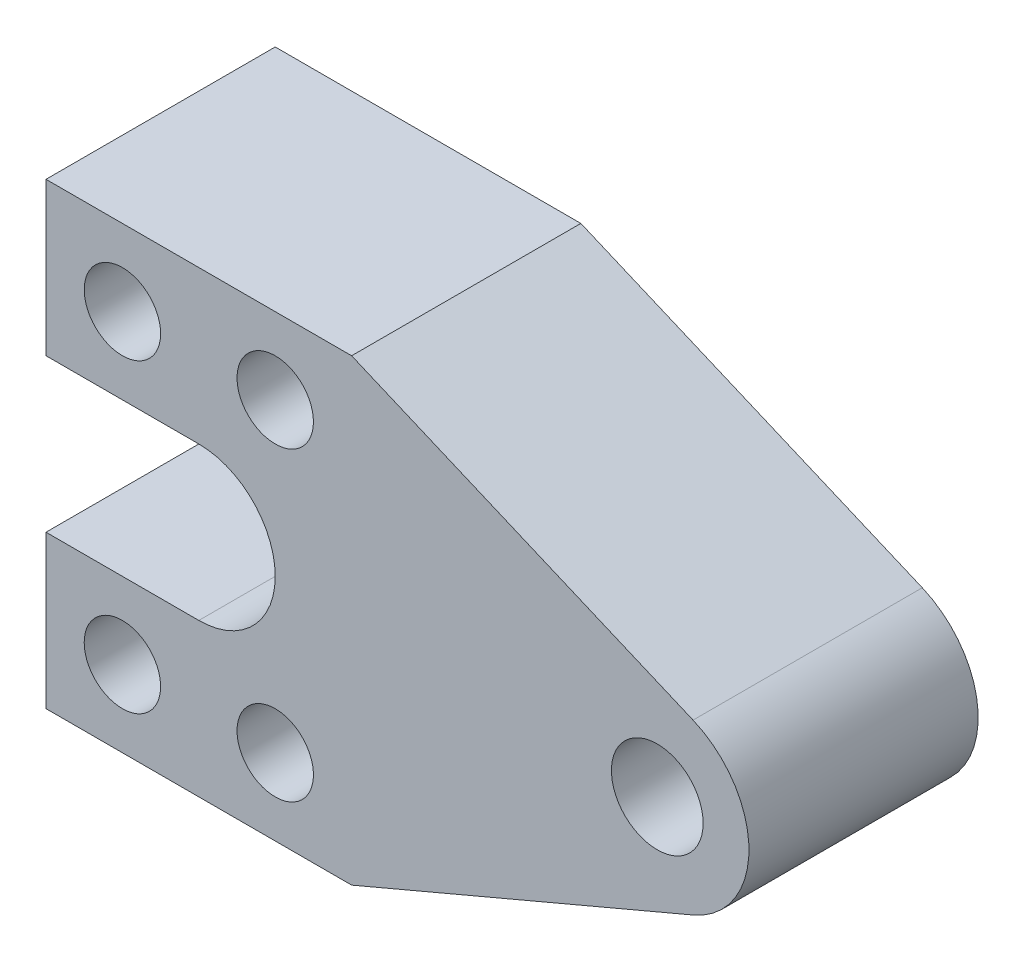
ISO-10303-21;
HEADER;
FILE_DESCRIPTION(('STEP AP214'),'2;1');
FILE_NAME('part.step','',(''),(''),'','','');
FILE_SCHEMA(('AUTOMOTIVE_DESIGN { 1 0 10303 214 1 1 1 1 }'));
ENDSEC;
DATA;
#1=APPLICATION_CONTEXT('core data for automotive mechanical design processes');
#2=APPLICATION_PROTOCOL_DEFINITION('international standard','automotive_design',2000,#1);
#3=PRODUCT_CONTEXT('',#1,'mechanical');
#4=PRODUCT('Part','Part','',(#3));
#5=PRODUCT_RELATED_PRODUCT_CATEGORY('part','',(#4));
#6=PRODUCT_DEFINITION_FORMATION('','',#4);
#7=PRODUCT_DEFINITION_CONTEXT('part definition',#1,'design');
#8=PRODUCT_DEFINITION('design','',#6,#7);
#9=PRODUCT_DEFINITION_SHAPE('','',#8);
#10=(LENGTH_UNIT() NAMED_UNIT(*) SI_UNIT(.MILLI.,.METRE.));
#11=(NAMED_UNIT(*) PLANE_ANGLE_UNIT() SI_UNIT($,.RADIAN.));
#12=(NAMED_UNIT(*) SI_UNIT($,.STERADIAN.) SOLID_ANGLE_UNIT());
#13=UNCERTAINTY_MEASURE_WITH_UNIT(LENGTH_MEASURE(1.E-05),#10,'distance_accuracy_value','');
#14=(GEOMETRIC_REPRESENTATION_CONTEXT(3) GLOBAL_UNCERTAINTY_ASSIGNED_CONTEXT((#13)) GLOBAL_UNIT_ASSIGNED_CONTEXT((#10,
#11,#12)) REPRESENTATION_CONTEXT('',''));
#15=CARTESIAN_POINT('',(0.,0.,0.));
#16=DIRECTION('',(0.,0.,1.));
#17=DIRECTION('',(1.,0.,0.));
#18=AXIS2_PLACEMENT_3D('',#15,#16,#17);
#19=CARTESIAN_POINT('',(30.,40.,15.));
#20=DIRECTION('',(0.,0.,-1.));
#21=DIRECTION('',(-1.,0.,0.));
#22=AXIS2_PLACEMENT_3D('',#19,#20,#21);
#23=PLANE('',#22);
#24=CARTESIAN_POINT('',(30.,40.,15.));
#25=DIRECTION('',(0.,0.,-1.));
#26=DIRECTION('',(-1.,0.,0.));
#27=AXIS2_PLACEMENT_3D('',#24,#25,#26);
#28=CIRCLE('',#27,10.);
#29=CARTESIAN_POINT('',(30.,50.,15.));
#30=VERTEX_POINT('',#29);
#31=CARTESIAN_POINT('',(30.,30.,15.));
#32=VERTEX_POINT('',#31);
#33=EDGE_CURVE('E161',#30,#32,#28,.T.);
#34=ORIENTED_EDGE('',*,*,#33,.T.);
#35=DIRECTION('',(-1.,0.,0.));
#36=VECTOR('',#35,1.);
#37=CARTESIAN_POINT('',(30.,30.,15.));
#38=LINE('',#37,#36);
#39=CARTESIAN_POINT('',(9.99999999999999,30.,15.));
#40=VERTEX_POINT('',#39);
#41=EDGE_CURVE('E99',#32,#40,#38,.T.);
#42=ORIENTED_EDGE('',*,*,#41,.T.);
#43=DIRECTION('',(0.,-1.,0.));
#44=VECTOR('',#43,1.);
#45=CARTESIAN_POINT('',(9.99999999999999,30.,15.));
#46=LINE('',#45,#44);
#47=CARTESIAN_POINT('',(10.,10.,15.));
#48=VERTEX_POINT('',#47);
#49=EDGE_CURVE('E182',#40,#48,#46,.T.);
#50=ORIENTED_EDGE('',*,*,#49,.T.);
#51=DIRECTION('',(1.,0.,0.));
#52=VECTOR('',#51,1.);
#53=CARTESIAN_POINT('',(10.,10.,15.));
#54=LINE('',#53,#52);
#55=CARTESIAN_POINT('',(50.,10.,15.));
#56=VERTEX_POINT('',#55);
#57=EDGE_CURVE('E201',#48,#56,#54,.T.);
#58=ORIENTED_EDGE('',*,*,#57,.T.);
#59=DIRECTION('',(0.920618310368742,0.390463732776557,0.));
#60=VECTOR('',#59,1.);
#61=CARTESIAN_POINT('',(50.,10.,15.));
#62=LINE('',#61,#60);
#63=CARTESIAN_POINT('',(94.6855647933187,28.9525802755751,15.));
#64=VERTEX_POINT('',#63);
#65=EDGE_CURVE('E198',#56,#64,#62,.T.);
#66=ORIENTED_EDGE('',*,*,#65,.T.);
#67=CARTESIAN_POINT('',(90.,40.,15.));
#68=DIRECTION('',(0.,0.,1.));
#69=DIRECTION('',(1.,0.,0.));
#70=AXIS2_PLACEMENT_3D('',#67,#68,#69);
#71=CIRCLE('',#70,12.);
#72=CARTESIAN_POINT('',(94.6855647933187,51.0474197244249,15.));
#73=VERTEX_POINT('',#72);
#74=EDGE_CURVE('E200',#64,#73,#71,.T.);
#75=ORIENTED_EDGE('',*,*,#74,.T.);
#76=DIRECTION('',(-0.920618310368742,0.390463732776557,0.));
#77=VECTOR('',#76,1.);
#78=CARTESIAN_POINT('',(50.,70.,15.));
#79=LINE('',#78,#77);
#80=CARTESIAN_POINT('',(50.,70.,15.));
#81=VERTEX_POINT('',#80);
#82=EDGE_CURVE('E124',#73,#81,#79,.T.);
#83=ORIENTED_EDGE('',*,*,#82,.T.);
#84=DIRECTION('',(-1.,0.,0.));
#85=VECTOR('',#84,1.);
#86=CARTESIAN_POINT('',(9.99999999999999,70.,15.));
#87=LINE('',#86,#85);
#88=CARTESIAN_POINT('',(9.99999999999999,70.,15.));
#89=VERTEX_POINT('',#88);
#90=EDGE_CURVE('E118',#81,#89,#87,.T.);
#91=ORIENTED_EDGE('',*,*,#90,.T.);
#92=DIRECTION('',(0.,-1.,0.));
#93=VECTOR('',#92,1.);
#94=CARTESIAN_POINT('',(9.99999999999999,70.,15.));
#95=LINE('',#94,#93);
#96=CARTESIAN_POINT('',(9.99999999999999,50.,15.));
#97=VERTEX_POINT('',#96);
#98=EDGE_CURVE('E122',#89,#97,#95,.T.);
#99=ORIENTED_EDGE('',*,*,#98,.T.);
#100=DIRECTION('',(1.,0.,0.));
#101=VECTOR('',#100,1.);
#102=CARTESIAN_POINT('',(9.99999999999999,50.,15.));
#103=LINE('',#102,#101);
#104=EDGE_CURVE('E50',#97,#30,#103,.T.);
#105=ORIENTED_EDGE('',*,*,#104,.T.);
#106=EDGE_LOOP('',(#34,#42,#50,#58,#66,#75,#83,#91,#99,#105));
#107=FACE_BOUND('',#106,.T.);
#108=CARTESIAN_POINT('',(20.,60.,15.));
#109=DIRECTION('',(0.,0.,1.));
#110=DIRECTION('',(1.,0.,0.));
#111=AXIS2_PLACEMENT_3D('',#108,#109,#110);
#112=CIRCLE('',#111,5.);
#113=CARTESIAN_POINT('',(25.,60.,15.));
#114=VERTEX_POINT('',#113);
#115=EDGE_CURVE('E146',#114,#114,#112,.T.);
#116=ORIENTED_EDGE('',*,*,#115,.F.);
#117=EDGE_LOOP('',(#116));
#118=FACE_BOUND('',#117,.T.);
#119=CARTESIAN_POINT('',(40.,60.,15.));
#120=DIRECTION('',(0.,0.,1.));
#121=DIRECTION('',(1.,0.,0.));
#122=AXIS2_PLACEMENT_3D('',#119,#120,#121);
#123=CIRCLE('',#122,5.);
#124=CARTESIAN_POINT('',(45.,60.,15.));
#125=VERTEX_POINT('',#124);
#126=EDGE_CURVE('E212',#125,#125,#123,.T.);
#127=ORIENTED_EDGE('',*,*,#126,.F.);
#128=EDGE_LOOP('',(#127));
#129=FACE_BOUND('',#128,.T.);
#130=CARTESIAN_POINT('',(90.,40.,15.));
#131=DIRECTION('',(0.,0.,1.));
#132=DIRECTION('',(1.,0.,0.));
#133=AXIS2_PLACEMENT_3D('',#130,#131,#132);
#134=CIRCLE('',#133,6.);
#135=CARTESIAN_POINT('',(96.,40.,15.));
#136=VERTEX_POINT('',#135);
#137=EDGE_CURVE('E218',#136,#136,#134,.T.);
#138=ORIENTED_EDGE('',*,*,#137,.F.);
#139=EDGE_LOOP('',(#138));
#140=FACE_BOUND('',#139,.T.);
#141=CARTESIAN_POINT('',(40.,20.,15.));
#142=DIRECTION('',(0.,0.,1.));
#143=DIRECTION('',(-1.,0.,0.));
#144=AXIS2_PLACEMENT_3D('',#141,#142,#143);
#145=CIRCLE('',#144,5.);
#146=CARTESIAN_POINT('',(35.,20.,15.));
#147=VERTEX_POINT('',#146);
#148=EDGE_CURVE('E224',#147,#147,#145,.T.);
#149=ORIENTED_EDGE('',*,*,#148,.F.);
#150=EDGE_LOOP('',(#149));
#151=FACE_BOUND('',#150,.T.);
#152=CARTESIAN_POINT('',(20.,20.,15.));
#153=DIRECTION('',(0.,0.,1.));
#154=DIRECTION('',(-1.,0.,0.));
#155=AXIS2_PLACEMENT_3D('',#152,#153,#154);
#156=CIRCLE('',#155,5.);
#157=CARTESIAN_POINT('',(15.,20.,15.));
#158=VERTEX_POINT('',#157);
#159=EDGE_CURVE('E230',#158,#158,#156,.T.);
#160=ORIENTED_EDGE('',*,*,#159,.F.);
#161=EDGE_LOOP('',(#160));
#162=FACE_BOUND('',#161,.T.);
#163=ADVANCED_FACE('F33',(#107,#118,#129,#140,#151,#162),#23,.F.);
#164=CARTESIAN_POINT('',(30.,40.,-15.));
#165=DIRECTION('',(0.,0.,-1.));
#166=DIRECTION('',(-1.,0.,0.));
#167=AXIS2_PLACEMENT_3D('',#164,#165,#166);
#168=PLANE('',#167);
#169=CARTESIAN_POINT('',(40.,20.,-15.));
#170=DIRECTION('',(0.,0.,1.));
#171=DIRECTION('',(-1.,0.,0.));
#172=AXIS2_PLACEMENT_3D('',#169,#170,#171);
#173=CIRCLE('',#172,5.);
#174=CARTESIAN_POINT('',(35.,20.,-15.));
#175=VERTEX_POINT('',#174);
#176=EDGE_CURVE('E227',#175,#175,#173,.T.);
#177=ORIENTED_EDGE('',*,*,#176,.T.);
#178=EDGE_LOOP('',(#177));
#179=FACE_BOUND('',#178,.T.);
#180=CARTESIAN_POINT('',(40.,60.,-15.));
#181=DIRECTION('',(0.,0.,1.));
#182=DIRECTION('',(1.,0.,0.));
#183=AXIS2_PLACEMENT_3D('',#180,#181,#182);
#184=CIRCLE('',#183,5.);
#185=CARTESIAN_POINT('',(45.,60.,-15.));
#186=VERTEX_POINT('',#185);
#187=EDGE_CURVE('E215',#186,#186,#184,.T.);
#188=ORIENTED_EDGE('',*,*,#187,.T.);
#189=EDGE_LOOP('',(#188));
#190=FACE_BOUND('',#189,.T.);
#191=CARTESIAN_POINT('',(30.,40.,-15.));
#192=DIRECTION('',(0.,0.,-1.));
#193=DIRECTION('',(-1.,0.,0.));
#194=AXIS2_PLACEMENT_3D('',#191,#192,#193);
#195=CIRCLE('',#194,10.);
#196=CARTESIAN_POINT('',(30.,50.,-15.));
#197=VERTEX_POINT('',#196);
#198=CARTESIAN_POINT('',(30.,30.,-15.));
#199=VERTEX_POINT('',#198);
#200=EDGE_CURVE('E142',#197,#199,#195,.T.);
#201=ORIENTED_EDGE('',*,*,#200,.F.);
#202=DIRECTION('',(1.,0.,0.));
#203=VECTOR('',#202,1.);
#204=CARTESIAN_POINT('',(9.99999999999999,50.,-15.));
#205=LINE('',#204,#203);
#206=CARTESIAN_POINT('',(9.99999999999999,50.,-15.));
#207=VERTEX_POINT('',#206);
#208=EDGE_CURVE('E91',#207,#197,#205,.T.);
#209=ORIENTED_EDGE('',*,*,#208,.F.);
#210=DIRECTION('',(0.,-1.,0.));
#211=VECTOR('',#210,1.);
#212=CARTESIAN_POINT('',(9.99999999999999,70.,-15.));
#213=LINE('',#212,#211);
#214=CARTESIAN_POINT('',(9.99999999999999,70.,-15.));
#215=VERTEX_POINT('',#214);
#216=EDGE_CURVE('E85',#215,#207,#213,.T.);
#217=ORIENTED_EDGE('',*,*,#216,.F.);
#218=DIRECTION('',(-1.,0.,0.));
#219=VECTOR('',#218,1.);
#220=CARTESIAN_POINT('',(9.99999999999999,70.,-15.));
#221=LINE('',#220,#219);
#222=CARTESIAN_POINT('',(50.,70.,-15.));
#223=VERTEX_POINT('',#222);
#224=EDGE_CURVE('E132',#223,#215,#221,.T.);
#225=ORIENTED_EDGE('',*,*,#224,.F.);
#226=DIRECTION('',(-0.920618310368742,0.390463732776557,0.));
#227=VECTOR('',#226,1.);
#228=CARTESIAN_POINT('',(50.,70.,-15.));
#229=LINE('',#228,#227);
#230=CARTESIAN_POINT('',(94.6855647933187,51.0474197244249,-15.));
#231=VERTEX_POINT('',#230);
#232=EDGE_CURVE('E156',#231,#223,#229,.T.);
#233=ORIENTED_EDGE('',*,*,#232,.F.);
#234=CARTESIAN_POINT('',(90.,40.,-15.));
#235=DIRECTION('',(0.,0.,1.));
#236=DIRECTION('',(1.,0.,0.));
#237=AXIS2_PLACEMENT_3D('',#234,#235,#236);
#238=CIRCLE('',#237,12.);
#239=CARTESIAN_POINT('',(94.6855647933187,28.9525802755751,-15.));
#240=VERTEX_POINT('',#239);
#241=EDGE_CURVE('E154',#240,#231,#238,.T.);
#242=ORIENTED_EDGE('',*,*,#241,.F.);
#243=DIRECTION('',(0.920618310368742,0.390463732776557,0.));
#244=VECTOR('',#243,1.);
#245=CARTESIAN_POINT('',(50.,10.,-15.));
#246=LINE('',#245,#244);
#247=CARTESIAN_POINT('',(50.,10.,-15.));
#248=VERTEX_POINT('',#247);
#249=EDGE_CURVE('E152',#248,#240,#246,.T.);
#250=ORIENTED_EDGE('',*,*,#249,.F.);
#251=DIRECTION('',(1.,0.,0.));
#252=VECTOR('',#251,1.);
#253=CARTESIAN_POINT('',(10.,10.,-15.));
#254=LINE('',#253,#252);
#255=CARTESIAN_POINT('',(10.,10.,-15.));
#256=VERTEX_POINT('',#255);
#257=EDGE_CURVE('E150',#256,#248,#254,.T.);
#258=ORIENTED_EDGE('',*,*,#257,.F.);
#259=DIRECTION('',(0.,-1.,0.));
#260=VECTOR('',#259,1.);
#261=CARTESIAN_POINT('',(9.99999999999999,30.,-15.));
#262=LINE('',#261,#260);
#263=CARTESIAN_POINT('',(9.99999999999999,30.,-15.));
#264=VERTEX_POINT('',#263);
#265=EDGE_CURVE('E148',#264,#256,#262,.T.);
#266=ORIENTED_EDGE('',*,*,#265,.F.);
#267=DIRECTION('',(-1.,0.,0.));
#268=VECTOR('',#267,1.);
#269=CARTESIAN_POINT('',(30.,30.,-15.));
#270=LINE('',#269,#268);
#271=EDGE_CURVE('E145',#199,#264,#270,.T.);
#272=ORIENTED_EDGE('',*,*,#271,.F.);
#273=EDGE_LOOP('',(#201,#209,#217,#225,#233,#242,#250,#258,#266,#272));
#274=FACE_BOUND('',#273,.T.);
#275=CARTESIAN_POINT('',(20.,60.,-15.));
#276=DIRECTION('',(0.,0.,1.));
#277=DIRECTION('',(1.,0.,0.));
#278=AXIS2_PLACEMENT_3D('',#275,#276,#277);
#279=CIRCLE('',#278,5.);
#280=CARTESIAN_POINT('',(25.,60.,-15.));
#281=VERTEX_POINT('',#280);
#282=EDGE_CURVE('E209',#281,#281,#279,.T.);
#283=ORIENTED_EDGE('',*,*,#282,.T.);
#284=EDGE_LOOP('',(#283));
#285=FACE_BOUND('',#284,.T.);
#286=CARTESIAN_POINT('',(90.,40.,-15.));
#287=DIRECTION('',(0.,0.,1.));
#288=DIRECTION('',(1.,0.,0.));
#289=AXIS2_PLACEMENT_3D('',#286,#287,#288);
#290=CIRCLE('',#289,6.);
#291=CARTESIAN_POINT('',(96.,40.,-15.));
#292=VERTEX_POINT('',#291);
#293=EDGE_CURVE('E221',#292,#292,#290,.T.);
#294=ORIENTED_EDGE('',*,*,#293,.T.);
#295=EDGE_LOOP('',(#294));
#296=FACE_BOUND('',#295,.T.);
#297=CARTESIAN_POINT('',(20.,20.,-15.));
#298=DIRECTION('',(0.,0.,1.));
#299=DIRECTION('',(-1.,0.,0.));
#300=AXIS2_PLACEMENT_3D('',#297,#298,#299);
#301=CIRCLE('',#300,5.);
#302=CARTESIAN_POINT('',(15.,20.,-15.));
#303=VERTEX_POINT('',#302);
#304=EDGE_CURVE('E233',#303,#303,#301,.T.);
#305=ORIENTED_EDGE('',*,*,#304,.T.);
#306=EDGE_LOOP('',(#305));
#307=FACE_BOUND('',#306,.T.);
#308=ADVANCED_FACE('F186',(#179,#190,#274,#285,#296,#307),#168,.T.);
#309=CARTESIAN_POINT('',(30.,40.,15.));
#310=DIRECTION('',(0.,0.,-1.));
#311=DIRECTION('',(-1.,0.,0.));
#312=AXIS2_PLACEMENT_3D('',#309,#310,#311);
#313=CYLINDRICAL_SURFACE('',#312,10.);
#314=ORIENTED_EDGE('',*,*,#200,.T.);
#315=DIRECTION('',(0.,0.,-1.));
#316=VECTOR('',#315,1.);
#317=CARTESIAN_POINT('',(30.,30.,15.));
#318=LINE('',#317,#316);
#319=EDGE_CURVE('E11',#32,#199,#318,.T.);
#320=ORIENTED_EDGE('',*,*,#319,.F.);
#321=ORIENTED_EDGE('',*,*,#33,.F.);
#322=DIRECTION('',(0.,0.,-1.));
#323=VECTOR('',#322,1.);
#324=CARTESIAN_POINT('',(30.,50.,15.));
#325=LINE('',#324,#323);
#326=EDGE_CURVE('E138',#30,#197,#325,.T.);
#327=ORIENTED_EDGE('',*,*,#326,.T.);
#328=EDGE_LOOP('',(#314,#320,#321,#327));
#329=FACE_BOUND('',#328,.T.);
#330=ADVANCED_FACE('F35',(#329),#313,.F.);
#331=CARTESIAN_POINT('',(30.,30.,15.));
#332=DIRECTION('',(0.,-1.,0.));
#333=DIRECTION('',(0.,0.,-1.));
#334=AXIS2_PLACEMENT_3D('',#331,#332,#333);
#335=PLANE('',#334);
#336=ORIENTED_EDGE('',*,*,#271,.T.);
#337=DIRECTION('',(0.,0.,-1.));
#338=VECTOR('',#337,1.);
#339=CARTESIAN_POINT('',(9.99999999999999,30.,15.));
#340=LINE('',#339,#338);
#341=EDGE_CURVE('E42',#40,#264,#340,.T.);
#342=ORIENTED_EDGE('',*,*,#341,.F.);
#343=ORIENTED_EDGE('',*,*,#41,.F.);
#344=ORIENTED_EDGE('',*,*,#319,.T.);
#345=EDGE_LOOP('',(#336,#342,#343,#344));
#346=FACE_BOUND('',#345,.T.);
#347=ADVANCED_FACE('F273',(#346),#335,.F.);
#348=CARTESIAN_POINT('',(9.99999999999999,30.,15.));
#349=DIRECTION('',(1.,0.,0.));
#350=DIRECTION('',(0.,1.,0.));
#351=AXIS2_PLACEMENT_3D('',#348,#349,#350);
#352=PLANE('',#351);
#353=ORIENTED_EDGE('',*,*,#265,.T.);
#354=DIRECTION('',(0.,0.,-1.));
#355=VECTOR('',#354,1.);
#356=CARTESIAN_POINT('',(10.,10.,15.));
#357=LINE('',#356,#355);
#358=EDGE_CURVE('E174',#48,#256,#357,.T.);
#359=ORIENTED_EDGE('',*,*,#358,.F.);
#360=ORIENTED_EDGE('',*,*,#49,.F.);
#361=ORIENTED_EDGE('',*,*,#341,.T.);
#362=EDGE_LOOP('',(#353,#359,#360,#361));
#363=FACE_BOUND('',#362,.T.);
#364=ADVANCED_FACE('F180',(#363),#352,.F.);
#365=CARTESIAN_POINT('',(10.,10.,15.));
#366=DIRECTION('',(0.,1.,0.));
#367=DIRECTION('',(0.,0.,1.));
#368=AXIS2_PLACEMENT_3D('',#365,#366,#367);
#369=PLANE('',#368);
#370=ORIENTED_EDGE('',*,*,#257,.T.);
#371=DIRECTION('',(0.,0.,-1.));
#372=VECTOR('',#371,1.);
#373=CARTESIAN_POINT('',(50.,10.,15.));
#374=LINE('',#373,#372);
#375=EDGE_CURVE('E171',#56,#248,#374,.T.);
#376=ORIENTED_EDGE('',*,*,#375,.F.);
#377=ORIENTED_EDGE('',*,*,#57,.F.);
#378=ORIENTED_EDGE('',*,*,#358,.T.);
#379=EDGE_LOOP('',(#370,#376,#377,#378));
#380=FACE_BOUND('',#379,.T.);
#381=ADVANCED_FACE('F192',(#380),#369,.F.);
#382=CARTESIAN_POINT('',(50.,10.,15.));
#383=DIRECTION('',(-0.390463732776557,0.920618310368742,0.));
#384=DIRECTION('',(-0.920618310368742,-0.390463732776557,0.));
#385=AXIS2_PLACEMENT_3D('',#382,#383,#384);
#386=PLANE('',#385);
#387=ORIENTED_EDGE('',*,*,#249,.T.);
#388=DIRECTION('',(0.,0.,-1.));
#389=VECTOR('',#388,1.);
#390=CARTESIAN_POINT('',(94.6855647933187,28.9525802755751,15.));
#391=LINE('',#390,#389);
#392=EDGE_CURVE('E168',#64,#240,#391,.T.);
#393=ORIENTED_EDGE('',*,*,#392,.F.);
#394=ORIENTED_EDGE('',*,*,#65,.F.);
#395=ORIENTED_EDGE('',*,*,#375,.T.);
#396=EDGE_LOOP('',(#387,#393,#394,#395));
#397=FACE_BOUND('',#396,.T.);
#398=ADVANCED_FACE('F196',(#397),#386,.F.);
#399=CARTESIAN_POINT('',(90.,40.,15.));
#400=DIRECTION('',(0.,0.,-1.));
#401=DIRECTION('',(-1.,0.,0.));
#402=AXIS2_PLACEMENT_3D('',#399,#400,#401);
#403=CYLINDRICAL_SURFACE('',#402,12.);
#404=ORIENTED_EDGE('',*,*,#241,.T.);
#405=DIRECTION('',(0.,0.,-1.));
#406=VECTOR('',#405,1.);
#407=CARTESIAN_POINT('',(94.6855647933187,51.0474197244249,15.));
#408=LINE('',#407,#406);
#409=EDGE_CURVE('E165',#73,#231,#408,.T.);
#410=ORIENTED_EDGE('',*,*,#409,.F.);
#411=ORIENTED_EDGE('',*,*,#74,.F.);
#412=ORIENTED_EDGE('',*,*,#392,.T.);
#413=EDGE_LOOP('',(#404,#410,#411,#412));
#414=FACE_BOUND('',#413,.T.);
#415=ADVANCED_FACE('F263',(#414),#403,.T.);
#416=CARTESIAN_POINT('',(50.,70.,15.));
#417=DIRECTION('',(-0.390463732776557,-0.920618310368742,0.));
#418=DIRECTION('',(0.920618310368742,-0.390463732776557,0.));
#419=AXIS2_PLACEMENT_3D('',#416,#417,#418);
#420=PLANE('',#419);
#421=ORIENTED_EDGE('',*,*,#232,.T.);
#422=DIRECTION('',(0.,0.,-1.));
#423=VECTOR('',#422,1.);
#424=CARTESIAN_POINT('',(50.,70.,15.));
#425=LINE('',#424,#423);
#426=EDGE_CURVE('E133',#81,#223,#425,.T.);
#427=ORIENTED_EDGE('',*,*,#426,.F.);
#428=ORIENTED_EDGE('',*,*,#82,.F.);
#429=ORIENTED_EDGE('',*,*,#409,.T.);
#430=EDGE_LOOP('',(#421,#427,#428,#429));
#431=FACE_BOUND('',#430,.T.);
#432=ADVANCED_FACE('F260',(#431),#420,.F.);
#433=CARTESIAN_POINT('',(9.99999999999999,70.,15.));
#434=DIRECTION('',(0.,-1.,0.));
#435=DIRECTION('',(1.,0.,0.));
#436=AXIS2_PLACEMENT_3D('',#433,#434,#435);
#437=PLANE('',#436);
#438=ORIENTED_EDGE('',*,*,#224,.T.);
#439=DIRECTION('',(0.,0.,-1.));
#440=VECTOR('',#439,1.);
#441=CARTESIAN_POINT('',(9.99999999999999,70.,15.));
#442=LINE('',#441,#440);
#443=EDGE_CURVE('E129',#89,#215,#442,.T.);
#444=ORIENTED_EDGE('',*,*,#443,.F.);
#445=ORIENTED_EDGE('',*,*,#90,.F.);
#446=ORIENTED_EDGE('',*,*,#426,.T.);
#447=EDGE_LOOP('',(#438,#444,#445,#446));
#448=FACE_BOUND('',#447,.T.);
#449=ADVANCED_FACE('F130',(#448),#437,.F.);
#450=CARTESIAN_POINT('',(9.99999999999999,70.,15.));
#451=DIRECTION('',(1.,0.,0.));
#452=DIRECTION('',(0.,0.,-1.));
#453=AXIS2_PLACEMENT_3D('',#450,#451,#452);
#454=PLANE('',#453);
#455=ORIENTED_EDGE('',*,*,#216,.T.);
#456=DIRECTION('',(0.,0.,-1.));
#457=VECTOR('',#456,1.);
#458=CARTESIAN_POINT('',(9.99999999999999,50.,15.));
#459=LINE('',#458,#457);
#460=EDGE_CURVE('E134',#97,#207,#459,.T.);
#461=ORIENTED_EDGE('',*,*,#460,.F.);
#462=ORIENTED_EDGE('',*,*,#98,.F.);
#463=ORIENTED_EDGE('',*,*,#443,.T.);
#464=EDGE_LOOP('',(#455,#461,#462,#463));
#465=FACE_BOUND('',#464,.T.);
#466=ADVANCED_FACE('F136',(#465),#454,.F.);
#467=CARTESIAN_POINT('',(9.99999999999999,50.,15.));
#468=DIRECTION('',(0.,1.,0.));
#469=DIRECTION('',(-1.,0.,0.));
#470=AXIS2_PLACEMENT_3D('',#467,#468,#469);
#471=PLANE('',#470);
#472=ORIENTED_EDGE('',*,*,#208,.T.);
#473=ORIENTED_EDGE('',*,*,#326,.F.);
#474=ORIENTED_EDGE('',*,*,#104,.F.);
#475=ORIENTED_EDGE('',*,*,#460,.T.);
#476=EDGE_LOOP('',(#472,#473,#474,#475));
#477=FACE_BOUND('',#476,.T.);
#478=ADVANCED_FACE('F253',(#477),#471,.F.);
#479=CARTESIAN_POINT('',(20.,60.,15.));
#480=DIRECTION('',(0.,0.,-1.));
#481=DIRECTION('',(-1.,0.,0.));
#482=AXIS2_PLACEMENT_3D('',#479,#480,#481);
#483=CYLINDRICAL_SURFACE('',#482,5.);
#484=ORIENTED_EDGE('',*,*,#115,.T.);
#485=EDGE_LOOP('',(#484));
#486=FACE_BOUND('',#485,.T.);
#487=ORIENTED_EDGE('',*,*,#282,.F.);
#488=EDGE_LOOP('',(#487));
#489=FACE_BOUND('',#488,.T.);
#490=ADVANCED_FACE('F250',(#486,#489),#483,.F.);
#491=CARTESIAN_POINT('',(40.,60.,15.));
#492=DIRECTION('',(0.,0.,-1.));
#493=DIRECTION('',(-1.,0.,0.));
#494=AXIS2_PLACEMENT_3D('',#491,#492,#493);
#495=CYLINDRICAL_SURFACE('',#494,5.);
#496=ORIENTED_EDGE('',*,*,#126,.T.);
#497=EDGE_LOOP('',(#496));
#498=FACE_BOUND('',#497,.T.);
#499=ORIENTED_EDGE('',*,*,#187,.F.);
#500=EDGE_LOOP('',(#499));
#501=FACE_BOUND('',#500,.T.);
#502=ADVANCED_FACE('F349',(#498,#501),#495,.F.);
#503=CARTESIAN_POINT('',(90.,40.,15.));
#504=DIRECTION('',(0.,0.,-1.));
#505=DIRECTION('',(-1.,0.,0.));
#506=AXIS2_PLACEMENT_3D('',#503,#504,#505);
#507=CYLINDRICAL_SURFACE('',#506,6.);
#508=ORIENTED_EDGE('',*,*,#137,.T.);
#509=EDGE_LOOP('',(#508));
#510=FACE_BOUND('',#509,.T.);
#511=ORIENTED_EDGE('',*,*,#293,.F.);
#512=EDGE_LOOP('',(#511));
#513=FACE_BOUND('',#512,.T.);
#514=ADVANCED_FACE('F357',(#510,#513),#507,.F.);
#515=CARTESIAN_POINT('',(40.,20.,15.));
#516=DIRECTION('',(0.,0.,-1.));
#517=DIRECTION('',(-1.,0.,0.));
#518=AXIS2_PLACEMENT_3D('',#515,#516,#517);
#519=CYLINDRICAL_SURFACE('',#518,5.);
#520=ORIENTED_EDGE('',*,*,#148,.T.);
#521=EDGE_LOOP('',(#520));
#522=FACE_BOUND('',#521,.T.);
#523=ORIENTED_EDGE('',*,*,#176,.F.);
#524=EDGE_LOOP('',(#523));
#525=FACE_BOUND('',#524,.T.);
#526=ADVANCED_FACE('F365',(#522,#525),#519,.F.);
#527=CARTESIAN_POINT('',(20.,20.,15.));
#528=DIRECTION('',(0.,0.,-1.));
#529=DIRECTION('',(-1.,0.,0.));
#530=AXIS2_PLACEMENT_3D('',#527,#528,#529);
#531=CYLINDRICAL_SURFACE('',#530,5.);
#532=ORIENTED_EDGE('',*,*,#159,.T.);
#533=EDGE_LOOP('',(#532));
#534=FACE_BOUND('',#533,.T.);
#535=ORIENTED_EDGE('',*,*,#304,.F.);
#536=EDGE_LOOP('',(#535));
#537=FACE_BOUND('',#536,.T.);
#538=ADVANCED_FACE('F239',(#534,#537),#531,.F.);
#539=CLOSED_SHELL('',(#163,#308,#330,#347,#364,#381,#398,#415,#432,#449,#466,#478,#490,#502,
#514,#526,#538));
#540=MANIFOLD_SOLID_BREP('B2',#539);
#541=ADVANCED_BREP_SHAPE_REPRESENTATION('',(#18,#540),#14);
#542=SHAPE_DEFINITION_REPRESENTATION(#9,#541);
ENDSEC;
END-ISO-10303-21;
